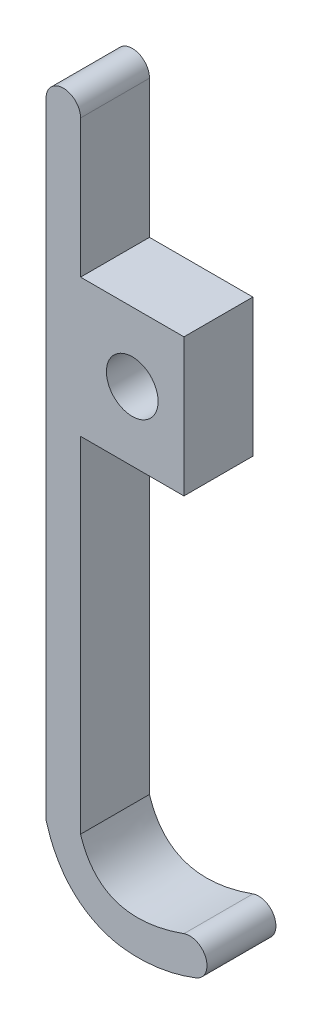
ISO-10303-21;
HEADER;
FILE_DESCRIPTION(('STEP AP214'),'2;1');
FILE_NAME('part.step','',(''),(''),'','','');
FILE_SCHEMA(('AUTOMOTIVE_DESIGN { 1 0 10303 214 1 1 1 1 }'));
ENDSEC;
DATA;
#1=APPLICATION_CONTEXT('core data for automotive mechanical design processes');
#2=APPLICATION_PROTOCOL_DEFINITION('international standard','automotive_design',2000,#1);
#3=PRODUCT_CONTEXT('',#1,'mechanical');
#4=PRODUCT('Part','Part','',(#3));
#5=PRODUCT_RELATED_PRODUCT_CATEGORY('part','',(#4));
#6=PRODUCT_DEFINITION_FORMATION('','',#4);
#7=PRODUCT_DEFINITION_CONTEXT('part definition',#1,'design');
#8=PRODUCT_DEFINITION('design','',#6,#7);
#9=PRODUCT_DEFINITION_SHAPE('','',#8);
#10=(LENGTH_UNIT() NAMED_UNIT(*) SI_UNIT(.MILLI.,.METRE.));
#11=(NAMED_UNIT(*) PLANE_ANGLE_UNIT() SI_UNIT($,.RADIAN.));
#12=(NAMED_UNIT(*) SI_UNIT($,.STERADIAN.) SOLID_ANGLE_UNIT());
#13=UNCERTAINTY_MEASURE_WITH_UNIT(LENGTH_MEASURE(1.E-05),#10,'distance_accuracy_value','');
#14=(GEOMETRIC_REPRESENTATION_CONTEXT(3) GLOBAL_UNCERTAINTY_ASSIGNED_CONTEXT((#13)) GLOBAL_UNIT_ASSIGNED_CONTEXT((#10,
#11,#12)) REPRESENTATION_CONTEXT('',''));
#15=CARTESIAN_POINT('',(0.,0.,0.));
#16=DIRECTION('',(0.,0.,1.));
#17=DIRECTION('',(1.,0.,0.));
#18=AXIS2_PLACEMENT_3D('',#15,#16,#17);
#19=CARTESIAN_POINT('',(0.,0.,2.));
#20=DIRECTION('',(-1.,0.,0.));
#21=DIRECTION('',(0.,-1.,0.));
#22=AXIS2_PLACEMENT_3D('',#19,#20,#21);
#23=PLANE('',#22);
#24=DIRECTION('',(0.,1.,0.));
#25=VECTOR('',#24,1.);
#26=CARTESIAN_POINT('',(0.,0.,0.));
#27=LINE('',#26,#25);
#28=CARTESIAN_POINT('',(0.,-18.,0.));
#29=VERTEX_POINT('',#28);
#30=CARTESIAN_POINT('',(0.,-8.,0.));
#31=VERTEX_POINT('',#30);
#32=EDGE_CURVE('E164',#29,#31,#27,.T.);
#33=ORIENTED_EDGE('',*,*,#32,.T.);
#34=DIRECTION('',(0.,0.,-1.));
#35=VECTOR('',#34,1.);
#36=CARTESIAN_POINT('',(0.,-8.,7.));
#37=LINE('',#36,#35);
#38=CARTESIAN_POINT('',(0.,-8.,2.));
#39=VERTEX_POINT('',#38);
#40=EDGE_CURVE('E63',#39,#31,#37,.T.);
#41=ORIENTED_EDGE('',*,*,#40,.F.);
#42=DIRECTION('',(0.,1.,0.));
#43=VECTOR('',#42,1.);
#44=CARTESIAN_POINT('',(0.,0.,2.));
#45=LINE('',#44,#43);
#46=CARTESIAN_POINT('',(0.,-18.,2.));
#47=VERTEX_POINT('',#46);
#48=EDGE_CURVE('E218',#47,#39,#45,.T.);
#49=ORIENTED_EDGE('',*,*,#48,.F.);
#50=DIRECTION('',(0.,0.,-1.));
#51=VECTOR('',#50,1.);
#52=CARTESIAN_POINT('',(0.,-18.,2.));
#53=LINE('',#52,#51);
#54=EDGE_CURVE('E257',#47,#29,#53,.T.);
#55=ORIENTED_EDGE('',*,*,#54,.T.);
#56=EDGE_LOOP('',(#33,#41,#49,#55));
#57=FACE_BOUND('',#56,.T.);
#58=ADVANCED_FACE('F39',(#57),#23,.F.);
#59=CARTESIAN_POINT('',(-0.5,0.,2.));
#60=DIRECTION('',(0.,0.,-1.));
#61=DIRECTION('',(-1.,0.,0.));
#62=AXIS2_PLACEMENT_3D('',#59,#60,#61);
#63=CYLINDRICAL_SURFACE('',#62,0.5);
#64=CARTESIAN_POINT('',(-0.5,0.,0.));
#65=DIRECTION('',(0.,0.,1.));
#66=DIRECTION('',(1.,0.,0.));
#67=AXIS2_PLACEMENT_3D('',#64,#65,#66);
#68=CIRCLE('',#67,0.5);
#69=CARTESIAN_POINT('',(0.,0.,0.));
#70=VERTEX_POINT('',#69);
#71=CARTESIAN_POINT('',(-1.,0.,0.));
#72=VERTEX_POINT('',#71);
#73=EDGE_CURVE('E225',#70,#72,#68,.T.);
#74=ORIENTED_EDGE('',*,*,#73,.T.);
#75=DIRECTION('',(0.,0.,-1.));
#76=VECTOR('',#75,1.);
#77=CARTESIAN_POINT('',(-1.,0.,2.));
#78=LINE('',#77,#76);
#79=CARTESIAN_POINT('',(-1.,0.,2.));
#80=VERTEX_POINT('',#79);
#81=EDGE_CURVE('E11',#80,#72,#78,.T.);
#82=ORIENTED_EDGE('',*,*,#81,.F.);
#83=CARTESIAN_POINT('',(-0.5,0.,2.));
#84=DIRECTION('',(0.,0.,1.));
#85=DIRECTION('',(1.,0.,0.));
#86=AXIS2_PLACEMENT_3D('',#83,#84,#85);
#87=CIRCLE('',#86,0.5);
#88=CARTESIAN_POINT('',(0.,0.,2.));
#89=VERTEX_POINT('',#88);
#90=EDGE_CURVE('E160',#89,#80,#87,.T.);
#91=ORIENTED_EDGE('',*,*,#90,.F.);
#92=DIRECTION('',(0.,0.,-1.));
#93=VECTOR('',#92,1.);
#94=CARTESIAN_POINT('',(0.,0.,2.));
#95=LINE('',#94,#93);
#96=EDGE_CURVE('E224',#89,#70,#95,.T.);
#97=ORIENTED_EDGE('',*,*,#96,.T.);
#98=EDGE_LOOP('',(#74,#82,#91,#97));
#99=FACE_BOUND('',#98,.T.);
#100=ADVANCED_FACE('F41',(#99),#63,.T.);
#101=CARTESIAN_POINT('',(-1.,0.,2.));
#102=DIRECTION('',(1.,0.,0.));
#103=DIRECTION('',(0.,1.,0.));
#104=AXIS2_PLACEMENT_3D('',#101,#102,#103);
#105=PLANE('',#104);
#106=DIRECTION('',(0.,-1.,0.));
#107=VECTOR('',#106,1.);
#108=CARTESIAN_POINT('',(-1.,0.,0.));
#109=LINE('',#108,#107);
#110=CARTESIAN_POINT('',(-0.999999999999998,-18.1550531335211,0.));
#111=VERTEX_POINT('',#110);
#112=EDGE_CURVE('E229',#72,#111,#109,.T.);
#113=ORIENTED_EDGE('',*,*,#112,.T.);
#114=DIRECTION('',(0.,0.,-1.));
#115=VECTOR('',#114,1.);
#116=CARTESIAN_POINT('',(-0.999999999999998,-18.1550531335211,2.));
#117=LINE('',#116,#115);
#118=CARTESIAN_POINT('',(-0.999999999999998,-18.1550531335211,2.));
#119=VERTEX_POINT('',#118);
#120=EDGE_CURVE('E48',#119,#111,#117,.T.);
#121=ORIENTED_EDGE('',*,*,#120,.F.);
#122=DIRECTION('',(0.,-1.,0.));
#123=VECTOR('',#122,1.);
#124=CARTESIAN_POINT('',(-1.,0.,2.));
#125=LINE('',#124,#123);
#126=EDGE_CURVE('E163',#80,#119,#125,.T.);
#127=ORIENTED_EDGE('',*,*,#126,.F.);
#128=ORIENTED_EDGE('',*,*,#81,.T.);
#129=EDGE_LOOP('',(#113,#121,#127,#128));
#130=FACE_BOUND('',#129,.T.);
#131=ADVANCED_FACE('F183',(#130),#105,.F.);
#132=CARTESIAN_POINT('',(-0.999999999999998,-18.1550531335211,2.));
#133=CARTESIAN_POINT('',(-0.975859651020626,-18.2327414005154,2.));
#134=CARTESIAN_POINT('',(-0.899448227978677,-18.4663639719045,2.));
#135=CARTESIAN_POINT('',(-0.756134802180623,-18.8178267335617,2.));
#136=CARTESIAN_POINT('',(-0.454907756877311,-19.3178696628619,2.));
#137=CARTESIAN_POINT('',(0.0279709696698661,-19.7928872086114,2.));
#138=CARTESIAN_POINT('',(0.777302206276191,-20.1972688943218,2.));
#139=CARTESIAN_POINT('',(2.2761733218116,-20.3524350909415,2.));
#140=CARTESIAN_POINT('',(3.33685857913224,-19.9415552547063,2.));
#141=B_SPLINE_CURVE_WITH_KNOTS('',2,(#132,#133,#134,#135,#136,#137,#138,#139,#140),
.UNSPECIFIED.,.F.,.F.,(3,1,1,1,1,1,1,3),(-0.0396881932599614,0.00904719079909932,
0.05778257485816,0.155253342976281,0.285214367133777,0.415175391291272,0.610116927527514,1.),.UNSPECIFIED.);
#142=DIRECTION('',(0.,0.,-1.));
#143=VECTOR('',#142,1.);
#144=SURFACE_OF_LINEAR_EXTRUSION('',#141,#143);
#145=CARTESIAN_POINT('',(-0.999999999999998,-18.1550531335211,0.));
#146=CARTESIAN_POINT('',(-0.975859651020626,-18.2327414005154,0.));
#147=CARTESIAN_POINT('',(-0.899448227978677,-18.4663639719045,0.));
#148=CARTESIAN_POINT('',(-0.756134802180623,-18.8178267335617,0.));
#149=CARTESIAN_POINT('',(-0.454907756877311,-19.3178696628619,0.));
#150=CARTESIAN_POINT('',(0.0279709696698661,-19.7928872086114,0.));
#151=CARTESIAN_POINT('',(0.777302206276191,-20.1972688943218,0.));
#152=CARTESIAN_POINT('',(2.2761733218116,-20.3524350909415,0.));
#153=CARTESIAN_POINT('',(3.33685857913224,-19.9415552547063,0.));
#154=B_SPLINE_CURVE_WITH_KNOTS('',2,(#145,#146,#147,#148,#149,#150,#151,#152,#153),
.UNSPECIFIED.,.F.,.F.,(3,1,1,1,1,1,1,3),(-0.0396881932599614,0.00904719079909932,
0.05778257485816,0.155253342976281,0.285214367133777,0.415175391291272,0.610116927527514,1.),.UNSPECIFIED.);
#155=CARTESIAN_POINT('',(3.33685857913224,-19.9415552547063,0.));
#156=VERTEX_POINT('',#155);
#157=EDGE_CURVE('E232',#111,#156,#154,.T.);
#158=ORIENTED_EDGE('',*,*,#157,.T.);
#159=DIRECTION('',(0.,0.,-1.));
#160=VECTOR('',#159,1.);
#161=CARTESIAN_POINT('',(3.33685857913224,-19.9415552547063,2.));
#162=LINE('',#161,#160);
#163=CARTESIAN_POINT('',(3.33685857913224,-19.9415552547063,2.));
#164=VERTEX_POINT('',#163);
#165=EDGE_CURVE('E265',#164,#156,#162,.T.);
#166=ORIENTED_EDGE('',*,*,#165,.F.);
#167=EDGE_CURVE('E167',#119,#164,#141,.T.);
#168=ORIENTED_EDGE('',*,*,#167,.F.);
#169=ORIENTED_EDGE('',*,*,#120,.T.);
#170=EDGE_LOOP('',(#158,#166,#168,#169));
#171=FACE_BOUND('',#170,.T.);
#172=ADVANCED_FACE('F179',(#171),#144,.F.);
#173=CARTESIAN_POINT('',(3.16842928956612,-19.4707776273531,2.));
#174=DIRECTION('',(0.,0.,-1.));
#175=DIRECTION('',(-1.,0.,0.));
#176=AXIS2_PLACEMENT_3D('',#173,#174,#175);
#177=CYLINDRICAL_SURFACE('',#176,0.499999999999999);
#178=CARTESIAN_POINT('',(3.16842928956612,-19.4707776273531,0.));
#179=DIRECTION('',(0.,0.,1.));
#180=DIRECTION('',(-1.,0.,0.));
#181=AXIS2_PLACEMENT_3D('',#178,#179,#180);
#182=CIRCLE('',#181,0.499999999999999);
#183=CARTESIAN_POINT('',(3.,-19.,0.));
#184=VERTEX_POINT('',#183);
#185=EDGE_CURVE('E237',#156,#184,#182,.T.);
#186=ORIENTED_EDGE('',*,*,#185,.T.);
#187=DIRECTION('',(0.,0.,-1.));
#188=VECTOR('',#187,1.);
#189=CARTESIAN_POINT('',(3.,-19.,2.));
#190=LINE('',#189,#188);
#191=CARTESIAN_POINT('',(3.,-19.,2.));
#192=VERTEX_POINT('',#191);
#193=EDGE_CURVE('E261',#192,#184,#190,.T.);
#194=ORIENTED_EDGE('',*,*,#193,.F.);
#195=CARTESIAN_POINT('',(3.16842928956612,-19.4707776273531,2.));
#196=DIRECTION('',(0.,0.,1.));
#197=DIRECTION('',(-1.,0.,0.));
#198=AXIS2_PLACEMENT_3D('',#195,#196,#197);
#199=CIRCLE('',#198,0.499999999999999);
#200=EDGE_CURVE('E173',#164,#192,#199,.T.);
#201=ORIENTED_EDGE('',*,*,#200,.F.);
#202=ORIENTED_EDGE('',*,*,#165,.T.);
#203=EDGE_LOOP('',(#186,#194,#201,#202));
#204=FACE_BOUND('',#203,.T.);
#205=ADVANCED_FACE('F182',(#204),#177,.T.);
#206=CARTESIAN_POINT('',(3.,-19.,2.));
#207=CARTESIAN_POINT('',(0.591537416119864,-19.8616714524652,2.));
#208=CARTESIAN_POINT('',(0.,-18.,2.));
#209=B_SPLINE_CURVE_WITH_KNOTS('',2,(#206,#207,#208),.UNSPECIFIED.,.F.,.F.,(3,3),(0.,1.),.UNSPECIFIED.);
#210=DIRECTION('',(0.,0.,-1.));
#211=VECTOR('',#210,1.);
#212=SURFACE_OF_LINEAR_EXTRUSION('',#209,#211);
#213=CARTESIAN_POINT('',(3.,-19.,0.));
#214=CARTESIAN_POINT('',(0.591537416119864,-19.8616714524652,0.));
#215=CARTESIAN_POINT('',(0.,-18.,0.));
#216=B_SPLINE_CURVE_WITH_KNOTS('',2,(#213,#214,#215),.UNSPECIFIED.,.F.,.F.,(3,3),(0.,1.),.UNSPECIFIED.);
#217=EDGE_CURVE('E243',#184,#29,#216,.T.);
#218=ORIENTED_EDGE('',*,*,#217,.T.);
#219=ORIENTED_EDGE('',*,*,#54,.F.);
#220=EDGE_CURVE('E212',#192,#47,#209,.T.);
#221=ORIENTED_EDGE('',*,*,#220,.F.);
#222=ORIENTED_EDGE('',*,*,#193,.T.);
#223=EDGE_LOOP('',(#218,#219,#221,#222));
#224=FACE_BOUND('',#223,.T.);
#225=ADVANCED_FACE('F200',(#224),#212,.F.);
#226=CARTESIAN_POINT('',(0.,-4.,2.));
#227=VERTEX_POINT('',#226);
#228=EDGE_CURVE('E55',#227,#89,#45,.T.);
#229=ORIENTED_EDGE('',*,*,#228,.F.);
#230=DIRECTION('',(0.,0.,-1.));
#231=VECTOR('',#230,1.);
#232=CARTESIAN_POINT('',(0.,-4.,7.));
#233=LINE('',#232,#231);
#234=CARTESIAN_POINT('',(0.,-4.,0.));
#235=VERTEX_POINT('',#234);
#236=EDGE_CURVE('E145',#227,#235,#233,.T.);
#237=ORIENTED_EDGE('',*,*,#236,.T.);
#238=EDGE_CURVE('E248',#235,#70,#27,.T.);
#239=ORIENTED_EDGE('',*,*,#238,.T.);
#240=ORIENTED_EDGE('',*,*,#96,.F.);
#241=EDGE_LOOP('',(#229,#237,#239,#240));
#242=FACE_BOUND('',#241,.T.);
#243=ADVANCED_FACE('F194',(#242),#23,.F.);
#244=CARTESIAN_POINT('',(-0.5,0.,2.));
#245=DIRECTION('',(0.,0.,1.));
#246=DIRECTION('',(1.,0.,0.));
#247=AXIS2_PLACEMENT_3D('',#244,#245,#246);
#248=PLANE('',#247);
#249=ORIENTED_EDGE('',*,*,#90,.T.);
#250=ORIENTED_EDGE('',*,*,#126,.T.);
#251=ORIENTED_EDGE('',*,*,#167,.T.);
#252=ORIENTED_EDGE('',*,*,#200,.T.);
#253=ORIENTED_EDGE('',*,*,#220,.T.);
#254=ORIENTED_EDGE('',*,*,#48,.T.);
#255=DIRECTION('',(-1.,0.,0.));
#256=VECTOR('',#255,1.);
#257=CARTESIAN_POINT('',(0.,-8.,2.));
#258=LINE('',#257,#256);
#259=CARTESIAN_POINT('',(3.,-8.,2.));
#260=VERTEX_POINT('',#259);
#261=EDGE_CURVE('E127',#260,#39,#258,.T.);
#262=ORIENTED_EDGE('',*,*,#261,.F.);
#263=DIRECTION('',(0.,-1.,0.));
#264=VECTOR('',#263,1.);
#265=CARTESIAN_POINT('',(3.,-4.,2.));
#266=LINE('',#265,#264);
#267=CARTESIAN_POINT('',(3.,-4.,2.));
#268=VERTEX_POINT('',#267);
#269=EDGE_CURVE('E118',#268,#260,#266,.T.);
#270=ORIENTED_EDGE('',*,*,#269,.F.);
#271=DIRECTION('',(1.,0.,0.));
#272=VECTOR('',#271,1.);
#273=CARTESIAN_POINT('',(0.,-4.,2.));
#274=LINE('',#273,#272);
#275=EDGE_CURVE('E124',#227,#268,#274,.T.);
#276=ORIENTED_EDGE('',*,*,#275,.F.);
#277=ORIENTED_EDGE('',*,*,#228,.T.);
#278=EDGE_LOOP('',(#249,#250,#251,#252,#253,#254,#262,#270,#276,#277));
#279=FACE_BOUND('',#278,.T.);
#280=CARTESIAN_POINT('',(1.5,-6.,2.));
#281=DIRECTION('',(0.,0.,1.));
#282=DIRECTION('',(1.,0.,0.));
#283=AXIS2_PLACEMENT_3D('',#280,#281,#282);
#284=CIRCLE('',#283,0.75);
#285=CARTESIAN_POINT('',(2.25,-6.,2.));
#286=VERTEX_POINT('',#285);
#287=EDGE_CURVE('E152',#286,#286,#284,.F.);
#288=ORIENTED_EDGE('',*,*,#287,.T.);
#289=EDGE_LOOP('',(#288));
#290=FACE_BOUND('',#289,.T.);
#291=ADVANCED_FACE('F121',(#279,#290),#248,.T.);
#292=CARTESIAN_POINT('',(-0.5,0.,0.));
#293=DIRECTION('',(0.,0.,1.));
#294=DIRECTION('',(1.,0.,0.));
#295=AXIS2_PLACEMENT_3D('',#292,#293,#294);
#296=PLANE('',#295);
#297=ORIENTED_EDGE('',*,*,#73,.F.);
#298=ORIENTED_EDGE('',*,*,#238,.F.);
#299=DIRECTION('',(1.,0.,0.));
#300=VECTOR('',#299,1.);
#301=CARTESIAN_POINT('',(0.,-4.,0.));
#302=LINE('',#301,#300);
#303=CARTESIAN_POINT('',(3.,-4.,0.));
#304=VERTEX_POINT('',#303);
#305=EDGE_CURVE('E295',#235,#304,#302,.T.);
#306=ORIENTED_EDGE('',*,*,#305,.T.);
#307=DIRECTION('',(0.,-1.,0.));
#308=VECTOR('',#307,1.);
#309=CARTESIAN_POINT('',(3.,-4.,0.));
#310=LINE('',#309,#308);
#311=CARTESIAN_POINT('',(3.,-8.,0.));
#312=VERTEX_POINT('',#311);
#313=EDGE_CURVE('E137',#304,#312,#310,.T.);
#314=ORIENTED_EDGE('',*,*,#313,.T.);
#315=DIRECTION('',(-1.,0.,0.));
#316=VECTOR('',#315,1.);
#317=CARTESIAN_POINT('',(0.,-8.,0.));
#318=LINE('',#317,#316);
#319=EDGE_CURVE('E290',#312,#31,#318,.T.);
#320=ORIENTED_EDGE('',*,*,#319,.T.);
#321=ORIENTED_EDGE('',*,*,#32,.F.);
#322=ORIENTED_EDGE('',*,*,#217,.F.);
#323=ORIENTED_EDGE('',*,*,#185,.F.);
#324=ORIENTED_EDGE('',*,*,#157,.F.);
#325=ORIENTED_EDGE('',*,*,#112,.F.);
#326=EDGE_LOOP('',(#297,#298,#306,#314,#320,#321,#322,#323,#324,#325));
#327=FACE_BOUND('',#326,.T.);
#328=CARTESIAN_POINT('',(1.5,-6.,0.));
#329=DIRECTION('',(0.,0.,-1.));
#330=DIRECTION('',(-1.,0.,0.));
#331=AXIS2_PLACEMENT_3D('',#328,#329,#330);
#332=CIRCLE('',#331,0.75);
#333=CARTESIAN_POINT('',(0.75,-6.,0.));
#334=VERTEX_POINT('',#333);
#335=EDGE_CURVE('E142',#334,#334,#332,.T.);
#336=ORIENTED_EDGE('',*,*,#335,.F.);
#337=EDGE_LOOP('',(#336));
#338=FACE_BOUND('',#337,.T.);
#339=ADVANCED_FACE('F205',(#327,#338),#296,.F.);
#340=CARTESIAN_POINT('',(0.,-8.,7.));
#341=DIRECTION('',(0.,-1.,0.));
#342=DIRECTION('',(0.,0.,-1.));
#343=AXIS2_PLACEMENT_3D('',#340,#341,#342);
#344=PLANE('',#343);
#345=DIRECTION('',(0.,0.,-1.));
#346=VECTOR('',#345,1.);
#347=CARTESIAN_POINT('',(3.,-8.,7.));
#348=LINE('',#347,#346);
#349=EDGE_CURVE('E131',#260,#312,#348,.T.);
#350=ORIENTED_EDGE('',*,*,#349,.F.);
#351=ORIENTED_EDGE('',*,*,#261,.T.);
#352=ORIENTED_EDGE('',*,*,#40,.T.);
#353=ORIENTED_EDGE('',*,*,#319,.F.);
#354=EDGE_LOOP('',(#350,#351,#352,#353));
#355=FACE_BOUND('',#354,.T.);
#356=ADVANCED_FACE('F305',(#355),#344,.T.);
#357=CARTESIAN_POINT('',(3.,-4.,7.));
#358=DIRECTION('',(1.,0.,0.));
#359=DIRECTION('',(0.,1.,0.));
#360=AXIS2_PLACEMENT_3D('',#357,#358,#359);
#361=PLANE('',#360);
#362=DIRECTION('',(0.,0.,-1.));
#363=VECTOR('',#362,1.);
#364=CARTESIAN_POINT('',(3.,-4.,7.));
#365=LINE('',#364,#363);
#366=EDGE_CURVE('E134',#268,#304,#365,.T.);
#367=ORIENTED_EDGE('',*,*,#366,.F.);
#368=ORIENTED_EDGE('',*,*,#269,.T.);
#369=ORIENTED_EDGE('',*,*,#349,.T.);
#370=ORIENTED_EDGE('',*,*,#313,.F.);
#371=EDGE_LOOP('',(#367,#368,#369,#370));
#372=FACE_BOUND('',#371,.T.);
#373=ADVANCED_FACE('F135',(#372),#361,.T.);
#374=CARTESIAN_POINT('',(0.,-4.,7.));
#375=DIRECTION('',(0.,1.,0.));
#376=DIRECTION('',(0.,0.,1.));
#377=AXIS2_PLACEMENT_3D('',#374,#375,#376);
#378=PLANE('',#377);
#379=ORIENTED_EDGE('',*,*,#236,.F.);
#380=ORIENTED_EDGE('',*,*,#275,.T.);
#381=ORIENTED_EDGE('',*,*,#366,.T.);
#382=ORIENTED_EDGE('',*,*,#305,.F.);
#383=EDGE_LOOP('',(#379,#380,#381,#382));
#384=FACE_BOUND('',#383,.T.);
#385=ADVANCED_FACE('F144',(#384),#378,.T.);
#386=CARTESIAN_POINT('',(1.5,-6.,7.));
#387=DIRECTION('',(0.,0.,-1.));
#388=DIRECTION('',(-1.,0.,0.));
#389=AXIS2_PLACEMENT_3D('',#386,#387,#388);
#390=CYLINDRICAL_SURFACE('',#389,0.75);
#391=ORIENTED_EDGE('',*,*,#335,.T.);
#392=EDGE_LOOP('',(#391));
#393=FACE_BOUND('',#392,.T.);
#394=ORIENTED_EDGE('',*,*,#287,.F.);
#395=EDGE_LOOP('',(#394));
#396=FACE_BOUND('',#395,.T.);
#397=ADVANCED_FACE('F302',(#393,#396),#390,.F.);
#398=CLOSED_SHELL('',(#58,#100,#131,#172,#205,#225,#243,#291,#339,#356,#373,#385,#397));
#399=MANIFOLD_SOLID_BREP('B2',#398);
#400=ADVANCED_BREP_SHAPE_REPRESENTATION('',(#18,#399),#14);
#401=SHAPE_DEFINITION_REPRESENTATION(#9,#400);
ENDSEC;
END-ISO-10303-21;
